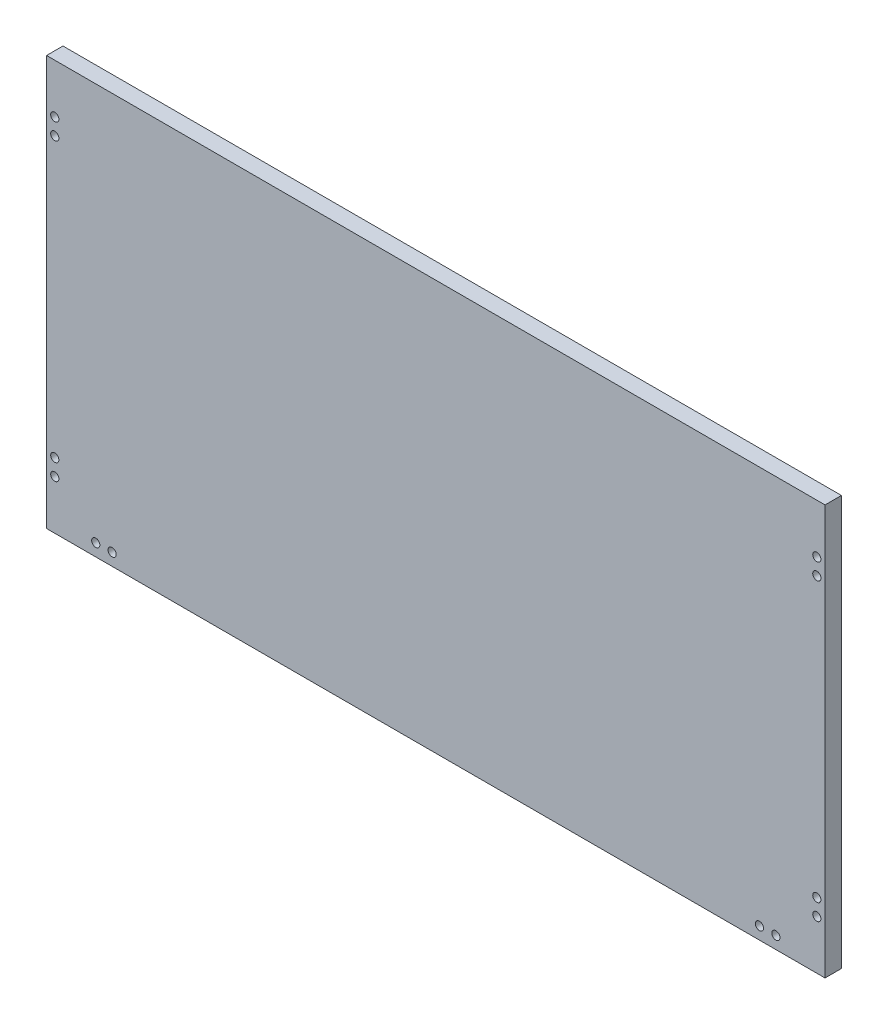
ISO-10303-21;
HEADER;
FILE_DESCRIPTION(('STEP AP214'),'2;1');
FILE_NAME('part.step','',(''),(''),'','','');
FILE_SCHEMA(('AUTOMOTIVE_DESIGN { 1 0 10303 214 1 1 1 1 }'));
ENDSEC;
DATA;
#1=APPLICATION_CONTEXT('core data for automotive mechanical design processes');
#2=APPLICATION_PROTOCOL_DEFINITION('international standard','automotive_design',2000,#1);
#3=PRODUCT_CONTEXT('',#1,'mechanical');
#4=PRODUCT('Part','Part','',(#3));
#5=PRODUCT_RELATED_PRODUCT_CATEGORY('part','',(#4));
#6=PRODUCT_DEFINITION_FORMATION('','',#4);
#7=PRODUCT_DEFINITION_CONTEXT('part definition',#1,'design');
#8=PRODUCT_DEFINITION('design','',#6,#7);
#9=PRODUCT_DEFINITION_SHAPE('','',#8);
#10=(LENGTH_UNIT() NAMED_UNIT(*) SI_UNIT(.MILLI.,.METRE.));
#11=(NAMED_UNIT(*) PLANE_ANGLE_UNIT() SI_UNIT($,.RADIAN.));
#12=(NAMED_UNIT(*) SI_UNIT($,.STERADIAN.) SOLID_ANGLE_UNIT());
#13=UNCERTAINTY_MEASURE_WITH_UNIT(LENGTH_MEASURE(1.E-05),#10,'distance_accuracy_value','');
#14=(GEOMETRIC_REPRESENTATION_CONTEXT(3) GLOBAL_UNCERTAINTY_ASSIGNED_CONTEXT((#13)) GLOBAL_UNIT_ASSIGNED_CONTEXT((#10,
#11,#12)) REPRESENTATION_CONTEXT('',''));
#15=CARTESIAN_POINT('',(0.,0.,0.));
#16=DIRECTION('',(0.,0.,1.));
#17=DIRECTION('',(1.,0.,0.));
#18=AXIS2_PLACEMENT_3D('',#15,#16,#17);
#19=CARTESIAN_POINT('',(237.5,125.,10.));
#20=DIRECTION('',(-1.,0.,0.));
#21=DIRECTION('',(0.,-1.,0.));
#22=AXIS2_PLACEMENT_3D('',#19,#20,#21);
#23=PLANE('',#22);
#24=DIRECTION('',(0.,1.,0.));
#25=VECTOR('',#24,1.);
#26=CARTESIAN_POINT('',(237.5,125.,0.));
#27=LINE('',#26,#25);
#28=CARTESIAN_POINT('',(237.5,-125.,0.));
#29=VERTEX_POINT('',#28);
#30=CARTESIAN_POINT('',(237.5,125.,0.));
#31=VERTEX_POINT('',#30);
#32=EDGE_CURVE('E99',#29,#31,#27,.T.);
#33=ORIENTED_EDGE('',*,*,#32,.T.);
#34=DIRECTION('',(0.,0.,-1.));
#35=VECTOR('',#34,1.);
#36=CARTESIAN_POINT('',(237.5,125.,10.));
#37=LINE('',#36,#35);
#38=CARTESIAN_POINT('',(237.5,125.,10.));
#39=VERTEX_POINT('',#38);
#40=EDGE_CURVE('E11',#39,#31,#37,.T.);
#41=ORIENTED_EDGE('',*,*,#40,.F.);
#42=DIRECTION('',(0.,1.,0.));
#43=VECTOR('',#42,1.);
#44=CARTESIAN_POINT('',(237.5,125.,10.));
#45=LINE('',#44,#43);
#46=CARTESIAN_POINT('',(237.5,-125.,10.));
#47=VERTEX_POINT('',#46);
#48=EDGE_CURVE('E87',#47,#39,#45,.T.);
#49=ORIENTED_EDGE('',*,*,#48,.F.);
#50=DIRECTION('',(0.,0.,-1.));
#51=VECTOR('',#50,1.);
#52=CARTESIAN_POINT('',(237.5,-125.,10.));
#53=LINE('',#52,#51);
#54=EDGE_CURVE('E95',#47,#29,#53,.T.);
#55=ORIENTED_EDGE('',*,*,#54,.T.);
#56=EDGE_LOOP('',(#33,#41,#49,#55));
#57=FACE_BOUND('',#56,.T.);
#58=ADVANCED_FACE('F36',(#57),#23,.F.);
#59=CARTESIAN_POINT('',(-237.5,125.,10.));
#60=DIRECTION('',(0.,-1.,0.));
#61=DIRECTION('',(0.,0.,-1.));
#62=AXIS2_PLACEMENT_3D('',#59,#60,#61);
#63=PLANE('',#62);
#64=DIRECTION('',(-1.,0.,0.));
#65=VECTOR('',#64,1.);
#66=CARTESIAN_POINT('',(-237.5,125.,0.));
#67=LINE('',#66,#65);
#68=CARTESIAN_POINT('',(-237.5,125.,0.));
#69=VERTEX_POINT('',#68);
#70=EDGE_CURVE('E91',#31,#69,#67,.T.);
#71=ORIENTED_EDGE('',*,*,#70,.T.);
#72=DIRECTION('',(0.,0.,-1.));
#73=VECTOR('',#72,1.);
#74=CARTESIAN_POINT('',(-237.5,125.,10.));
#75=LINE('',#74,#73);
#76=CARTESIAN_POINT('',(-237.5,125.,10.));
#77=VERTEX_POINT('',#76);
#78=EDGE_CURVE('E44',#77,#69,#75,.T.);
#79=ORIENTED_EDGE('',*,*,#78,.F.);
#80=DIRECTION('',(-1.,0.,0.));
#81=VECTOR('',#80,1.);
#82=CARTESIAN_POINT('',(-237.5,125.,10.));
#83=LINE('',#82,#81);
#84=EDGE_CURVE('E82',#39,#77,#83,.T.);
#85=ORIENTED_EDGE('',*,*,#84,.F.);
#86=ORIENTED_EDGE('',*,*,#40,.T.);
#87=EDGE_LOOP('',(#71,#79,#85,#86));
#88=FACE_BOUND('',#87,.T.);
#89=ADVANCED_FACE('F90',(#88),#63,.F.);
#90=CARTESIAN_POINT('',(-237.5,125.,10.));
#91=DIRECTION('',(1.,0.,0.));
#92=DIRECTION('',(0.,1.,0.));
#93=AXIS2_PLACEMENT_3D('',#90,#91,#92);
#94=PLANE('',#93);
#95=DIRECTION('',(0.,-1.,0.));
#96=VECTOR('',#95,1.);
#97=CARTESIAN_POINT('',(-237.5,125.,0.));
#98=LINE('',#97,#96);
#99=CARTESIAN_POINT('',(-237.5,-125.,0.));
#100=VERTEX_POINT('',#99);
#101=EDGE_CURVE('E69',#69,#100,#98,.T.);
#102=ORIENTED_EDGE('',*,*,#101,.T.);
#103=DIRECTION('',(0.,0.,-1.));
#104=VECTOR('',#103,1.);
#105=CARTESIAN_POINT('',(-237.5,-125.,10.));
#106=LINE('',#105,#104);
#107=CARTESIAN_POINT('',(-237.5,-125.,10.));
#108=VERTEX_POINT('',#107);
#109=EDGE_CURVE('E92',#108,#100,#106,.T.);
#110=ORIENTED_EDGE('',*,*,#109,.F.);
#111=DIRECTION('',(0.,-1.,0.));
#112=VECTOR('',#111,1.);
#113=CARTESIAN_POINT('',(-237.5,125.,10.));
#114=LINE('',#113,#112);
#115=EDGE_CURVE('E85',#77,#108,#114,.T.);
#116=ORIENTED_EDGE('',*,*,#115,.F.);
#117=ORIENTED_EDGE('',*,*,#78,.T.);
#118=EDGE_LOOP('',(#102,#110,#116,#117));
#119=FACE_BOUND('',#118,.T.);
#120=ADVANCED_FACE('F93',(#119),#94,.F.);
#121=CARTESIAN_POINT('',(-237.5,-125.,10.));
#122=DIRECTION('',(0.,1.,0.));
#123=DIRECTION('',(0.,0.,1.));
#124=AXIS2_PLACEMENT_3D('',#121,#122,#123);
#125=PLANE('',#124);
#126=DIRECTION('',(1.,0.,0.));
#127=VECTOR('',#126,1.);
#128=CARTESIAN_POINT('',(-237.5,-125.,0.));
#129=LINE('',#128,#127);
#130=EDGE_CURVE('E75',#100,#29,#129,.T.);
#131=ORIENTED_EDGE('',*,*,#130,.T.);
#132=ORIENTED_EDGE('',*,*,#54,.F.);
#133=DIRECTION('',(1.,0.,0.));
#134=VECTOR('',#133,1.);
#135=CARTESIAN_POINT('',(-237.5,-125.,10.));
#136=LINE('',#135,#134);
#137=EDGE_CURVE('E52',#108,#47,#136,.T.);
#138=ORIENTED_EDGE('',*,*,#137,.F.);
#139=ORIENTED_EDGE('',*,*,#109,.T.);
#140=EDGE_LOOP('',(#131,#132,#138,#139));
#141=FACE_BOUND('',#140,.T.);
#142=ADVANCED_FACE('F107',(#141),#125,.F.);
#143=CARTESIAN_POINT('',(0.,0.,10.));
#144=DIRECTION('',(0.,0.,1.));
#145=DIRECTION('',(1.,0.,0.));
#146=AXIS2_PLACEMENT_3D('',#143,#144,#145);
#147=PLANE('',#146);
#148=CARTESIAN_POINT('',(-232.5,85.,10.));
#149=DIRECTION('',(0.,0.,1.));
#150=DIRECTION('',(1.,0.,0.));
#151=AXIS2_PLACEMENT_3D('',#148,#149,#150);
#152=CIRCLE('',#151,2.5);
#153=CARTESIAN_POINT('',(-230.,85.,10.));
#154=VERTEX_POINT('',#153);
#155=EDGE_CURVE('E162',#154,#154,#152,.T.);
#156=ORIENTED_EDGE('',*,*,#155,.F.);
#157=EDGE_LOOP('',(#156));
#158=FACE_BOUND('',#157,.T.);
#159=CARTESIAN_POINT('',(-207.5,-117.5,10.));
#160=DIRECTION('',(0.,0.,1.));
#161=DIRECTION('',(1.,0.,0.));
#162=AXIS2_PLACEMENT_3D('',#159,#160,#161);
#163=CIRCLE('',#162,2.5);
#164=CARTESIAN_POINT('',(-205.,-117.5,10.));
#165=VERTEX_POINT('',#164);
#166=EDGE_CURVE('E156',#165,#165,#163,.T.);
#167=ORIENTED_EDGE('',*,*,#166,.F.);
#168=EDGE_LOOP('',(#167));
#169=FACE_BOUND('',#168,.T.);
#170=CARTESIAN_POINT('',(-197.5,-117.5,10.));
#171=DIRECTION('',(0.,0.,1.));
#172=DIRECTION('',(1.,0.,0.));
#173=AXIS2_PLACEMENT_3D('',#170,#171,#172);
#174=CIRCLE('',#173,2.5);
#175=CARTESIAN_POINT('',(-195.,-117.5,10.));
#176=VERTEX_POINT('',#175);
#177=EDGE_CURVE('E150',#176,#176,#174,.T.);
#178=ORIENTED_EDGE('',*,*,#177,.F.);
#179=EDGE_LOOP('',(#178));
#180=FACE_BOUND('',#179,.T.);
#181=CARTESIAN_POINT('',(197.5,-117.5,10.));
#182=DIRECTION('',(0.,0.,1.));
#183=DIRECTION('',(1.,0.,0.));
#184=AXIS2_PLACEMENT_3D('',#181,#182,#183);
#185=CIRCLE('',#184,2.5);
#186=CARTESIAN_POINT('',(200.,-117.5,10.));
#187=VERTEX_POINT('',#186);
#188=EDGE_CURVE('E132',#187,#187,#185,.T.);
#189=ORIENTED_EDGE('',*,*,#188,.F.);
#190=EDGE_LOOP('',(#189));
#191=FACE_BOUND('',#190,.T.);
#192=CARTESIAN_POINT('',(232.5,-85.,10.));
#193=DIRECTION('',(0.,0.,1.));
#194=DIRECTION('',(1.,0.,0.));
#195=AXIS2_PLACEMENT_3D('',#192,#193,#194);
#196=CIRCLE('',#195,2.5);
#197=CARTESIAN_POINT('',(235.,-85.,10.));
#198=VERTEX_POINT('',#197);
#199=EDGE_CURVE('E133',#198,#198,#196,.T.);
#200=ORIENTED_EDGE('',*,*,#199,.F.);
#201=EDGE_LOOP('',(#200));
#202=FACE_BOUND('',#201,.T.);
#203=CARTESIAN_POINT('',(232.5,85.,10.));
#204=DIRECTION('',(0.,0.,1.));
#205=DIRECTION('',(1.,0.,0.));
#206=AXIS2_PLACEMENT_3D('',#203,#204,#205);
#207=CIRCLE('',#206,2.5);
#208=CARTESIAN_POINT('',(235.,85.,10.));
#209=VERTEX_POINT('',#208);
#210=EDGE_CURVE('E140',#209,#209,#207,.T.);
#211=ORIENTED_EDGE('',*,*,#210,.F.);
#212=EDGE_LOOP('',(#211));
#213=FACE_BOUND('',#212,.T.);
#214=CARTESIAN_POINT('',(232.5,95.,10.));
#215=DIRECTION('',(0.,0.,1.));
#216=DIRECTION('',(1.,0.,0.));
#217=AXIS2_PLACEMENT_3D('',#214,#215,#216);
#218=CIRCLE('',#217,2.5);
#219=CARTESIAN_POINT('',(235.,95.,10.));
#220=VERTEX_POINT('',#219);
#221=EDGE_CURVE('E119',#220,#220,#218,.T.);
#222=ORIENTED_EDGE('',*,*,#221,.F.);
#223=EDGE_LOOP('',(#222));
#224=FACE_BOUND('',#223,.T.);
#225=CARTESIAN_POINT('',(207.5,-117.5,10.));
#226=DIRECTION('',(0.,0.,1.));
#227=DIRECTION('',(1.,0.,0.));
#228=AXIS2_PLACEMENT_3D('',#225,#226,#227);
#229=CIRCLE('',#228,2.5);
#230=CARTESIAN_POINT('',(210.,-117.5,10.));
#231=VERTEX_POINT('',#230);
#232=EDGE_CURVE('E126',#231,#231,#229,.T.);
#233=ORIENTED_EDGE('',*,*,#232,.F.);
#234=EDGE_LOOP('',(#233));
#235=FACE_BOUND('',#234,.T.);
#236=CARTESIAN_POINT('',(-232.5,-95.,10.));
#237=DIRECTION('',(0.,0.,1.));
#238=DIRECTION('',(1.,0.,0.));
#239=AXIS2_PLACEMENT_3D('',#236,#237,#238);
#240=CIRCLE('',#239,2.5);
#241=CARTESIAN_POINT('',(-230.,-95.,10.));
#242=VERTEX_POINT('',#241);
#243=EDGE_CURVE('E179',#242,#242,#240,.T.);
#244=ORIENTED_EDGE('',*,*,#243,.F.);
#245=EDGE_LOOP('',(#244));
#246=FACE_BOUND('',#245,.T.);
#247=CARTESIAN_POINT('',(-232.5,-85.,10.));
#248=DIRECTION('',(0.,0.,1.));
#249=DIRECTION('',(1.,0.,0.));
#250=AXIS2_PLACEMENT_3D('',#247,#248,#249);
#251=CIRCLE('',#250,2.5);
#252=CARTESIAN_POINT('',(-230.,-85.,10.));
#253=VERTEX_POINT('',#252);
#254=EDGE_CURVE('E167',#253,#253,#251,.T.);
#255=ORIENTED_EDGE('',*,*,#254,.F.);
#256=EDGE_LOOP('',(#255));
#257=FACE_BOUND('',#256,.T.);
#258=CARTESIAN_POINT('',(232.5,-95.,10.));
#259=DIRECTION('',(0.,0.,1.));
#260=DIRECTION('',(1.,0.,0.));
#261=AXIS2_PLACEMENT_3D('',#258,#259,#260);
#262=CIRCLE('',#261,2.5);
#263=CARTESIAN_POINT('',(235.,-95.,10.));
#264=VERTEX_POINT('',#263);
#265=EDGE_CURVE('E174',#264,#264,#262,.T.);
#266=ORIENTED_EDGE('',*,*,#265,.F.);
#267=EDGE_LOOP('',(#266));
#268=FACE_BOUND('',#267,.T.);
#269=CARTESIAN_POINT('',(-232.5,95.,10.));
#270=DIRECTION('',(0.,0.,1.));
#271=DIRECTION('',(1.,0.,0.));
#272=AXIS2_PLACEMENT_3D('',#269,#270,#271);
#273=CIRCLE('',#272,2.5);
#274=CARTESIAN_POINT('',(-230.,95.,10.));
#275=VERTEX_POINT('',#274);
#276=EDGE_CURVE('E113',#275,#275,#273,.T.);
#277=ORIENTED_EDGE('',*,*,#276,.F.);
#278=EDGE_LOOP('',(#277));
#279=FACE_BOUND('',#278,.T.);
#280=ORIENTED_EDGE('',*,*,#48,.T.);
#281=ORIENTED_EDGE('',*,*,#84,.T.);
#282=ORIENTED_EDGE('',*,*,#115,.T.);
#283=ORIENTED_EDGE('',*,*,#137,.T.);
#284=EDGE_LOOP('',(#280,#281,#282,#283));
#285=FACE_BOUND('',#284,.T.);
#286=ADVANCED_FACE('F83',(#158,#169,#180,#191,#202,#213,#224,#235,#246,#257,#268,#279,#285),
#147,.T.);
#287=CARTESIAN_POINT('',(0.,0.,0.));
#288=DIRECTION('',(0.,0.,1.));
#289=DIRECTION('',(1.,0.,0.));
#290=AXIS2_PLACEMENT_3D('',#287,#288,#289);
#291=PLANE('',#290);
#292=CARTESIAN_POINT('',(-232.5,85.,0.));
#293=DIRECTION('',(0.,0.,1.));
#294=DIRECTION('',(1.,0.,0.));
#295=AXIS2_PLACEMENT_3D('',#292,#293,#294);
#296=CIRCLE('',#295,2.5);
#297=CARTESIAN_POINT('',(-230.,85.,0.));
#298=VERTEX_POINT('',#297);
#299=EDGE_CURVE('E116',#298,#298,#296,.T.);
#300=ORIENTED_EDGE('',*,*,#299,.T.);
#301=EDGE_LOOP('',(#300));
#302=FACE_BOUND('',#301,.T.);
#303=CARTESIAN_POINT('',(-207.5,-117.5,0.));
#304=DIRECTION('',(0.,0.,1.));
#305=DIRECTION('',(1.,0.,0.));
#306=AXIS2_PLACEMENT_3D('',#303,#304,#305);
#307=CIRCLE('',#306,2.5);
#308=CARTESIAN_POINT('',(-205.,-117.5,0.));
#309=VERTEX_POINT('',#308);
#310=EDGE_CURVE('E159',#309,#309,#307,.T.);
#311=ORIENTED_EDGE('',*,*,#310,.T.);
#312=EDGE_LOOP('',(#311));
#313=FACE_BOUND('',#312,.T.);
#314=CARTESIAN_POINT('',(-197.5,-117.5,0.));
#315=DIRECTION('',(0.,0.,1.));
#316=DIRECTION('',(1.,0.,0.));
#317=AXIS2_PLACEMENT_3D('',#314,#315,#316);
#318=CIRCLE('',#317,2.5);
#319=CARTESIAN_POINT('',(-195.,-117.5,0.));
#320=VERTEX_POINT('',#319);
#321=EDGE_CURVE('E153',#320,#320,#318,.T.);
#322=ORIENTED_EDGE('',*,*,#321,.T.);
#323=EDGE_LOOP('',(#322));
#324=FACE_BOUND('',#323,.T.);
#325=CARTESIAN_POINT('',(197.5,-117.5,0.));
#326=DIRECTION('',(0.,0.,1.));
#327=DIRECTION('',(1.,0.,0.));
#328=AXIS2_PLACEMENT_3D('',#325,#326,#327);
#329=CIRCLE('',#328,2.5);
#330=CARTESIAN_POINT('',(200.,-117.5,0.));
#331=VERTEX_POINT('',#330);
#332=EDGE_CURVE('E147',#331,#331,#329,.T.);
#333=ORIENTED_EDGE('',*,*,#332,.T.);
#334=EDGE_LOOP('',(#333));
#335=FACE_BOUND('',#334,.T.);
#336=CARTESIAN_POINT('',(232.5,-85.,0.));
#337=DIRECTION('',(0.,0.,1.));
#338=DIRECTION('',(1.,0.,0.));
#339=AXIS2_PLACEMENT_3D('',#336,#337,#338);
#340=CIRCLE('',#339,2.5);
#341=CARTESIAN_POINT('',(235.,-85.,0.));
#342=VERTEX_POINT('',#341);
#343=EDGE_CURVE('E136',#342,#342,#340,.T.);
#344=ORIENTED_EDGE('',*,*,#343,.T.);
#345=EDGE_LOOP('',(#344));
#346=FACE_BOUND('',#345,.T.);
#347=CARTESIAN_POINT('',(232.5,85.,0.));
#348=DIRECTION('',(0.,0.,1.));
#349=DIRECTION('',(1.,0.,0.));
#350=AXIS2_PLACEMENT_3D('',#347,#348,#349);
#351=CIRCLE('',#350,2.5);
#352=CARTESIAN_POINT('',(235.,85.,0.));
#353=VERTEX_POINT('',#352);
#354=EDGE_CURVE('E123',#353,#353,#351,.T.);
#355=ORIENTED_EDGE('',*,*,#354,.T.);
#356=EDGE_LOOP('',(#355));
#357=FACE_BOUND('',#356,.T.);
#358=CARTESIAN_POINT('',(232.5,95.,0.));
#359=DIRECTION('',(0.,0.,1.));
#360=DIRECTION('',(1.,0.,0.));
#361=AXIS2_PLACEMENT_3D('',#358,#359,#360);
#362=CIRCLE('',#361,2.5);
#363=CARTESIAN_POINT('',(235.,95.,0.));
#364=VERTEX_POINT('',#363);
#365=EDGE_CURVE('E122',#364,#364,#362,.T.);
#366=ORIENTED_EDGE('',*,*,#365,.T.);
#367=EDGE_LOOP('',(#366));
#368=FACE_BOUND('',#367,.T.);
#369=CARTESIAN_POINT('',(207.5,-117.5,0.));
#370=DIRECTION('',(0.,0.,1.));
#371=DIRECTION('',(1.,0.,0.));
#372=AXIS2_PLACEMENT_3D('',#369,#370,#371);
#373=CIRCLE('',#372,2.5);
#374=CARTESIAN_POINT('',(210.,-117.5,0.));
#375=VERTEX_POINT('',#374);
#376=EDGE_CURVE('E129',#375,#375,#373,.T.);
#377=ORIENTED_EDGE('',*,*,#376,.T.);
#378=EDGE_LOOP('',(#377));
#379=FACE_BOUND('',#378,.T.);
#380=CARTESIAN_POINT('',(-232.5,-95.,0.));
#381=DIRECTION('',(0.,0.,1.));
#382=DIRECTION('',(1.,0.,0.));
#383=AXIS2_PLACEMENT_3D('',#380,#381,#382);
#384=CIRCLE('',#383,2.5);
#385=CARTESIAN_POINT('',(-230.,-95.,0.));
#386=VERTEX_POINT('',#385);
#387=EDGE_CURVE('E171',#386,#386,#384,.T.);
#388=ORIENTED_EDGE('',*,*,#387,.T.);
#389=EDGE_LOOP('',(#388));
#390=FACE_BOUND('',#389,.T.);
#391=CARTESIAN_POINT('',(-232.5,-85.,0.));
#392=DIRECTION('',(0.,0.,1.));
#393=DIRECTION('',(1.,0.,0.));
#394=AXIS2_PLACEMENT_3D('',#391,#392,#393);
#395=CIRCLE('',#394,2.5);
#396=CARTESIAN_POINT('',(-230.,-85.,0.));
#397=VERTEX_POINT('',#396);
#398=EDGE_CURVE('E170',#397,#397,#395,.T.);
#399=ORIENTED_EDGE('',*,*,#398,.T.);
#400=EDGE_LOOP('',(#399));
#401=FACE_BOUND('',#400,.T.);
#402=CARTESIAN_POINT('',(232.5,-95.,0.));
#403=DIRECTION('',(0.,0.,1.));
#404=DIRECTION('',(1.,0.,0.));
#405=AXIS2_PLACEMENT_3D('',#402,#403,#404);
#406=CIRCLE('',#405,2.5);
#407=CARTESIAN_POINT('',(235.,-95.,0.));
#408=VERTEX_POINT('',#407);
#409=EDGE_CURVE('E137',#408,#408,#406,.T.);
#410=ORIENTED_EDGE('',*,*,#409,.T.);
#411=EDGE_LOOP('',(#410));
#412=FACE_BOUND('',#411,.T.);
#413=CARTESIAN_POINT('',(-232.5,95.,0.));
#414=DIRECTION('',(0.,0.,1.));
#415=DIRECTION('',(1.,0.,0.));
#416=AXIS2_PLACEMENT_3D('',#413,#414,#415);
#417=CIRCLE('',#416,2.5);
#418=CARTESIAN_POINT('',(-230.,95.,0.));
#419=VERTEX_POINT('',#418);
#420=EDGE_CURVE('E102',#419,#419,#417,.T.);
#421=ORIENTED_EDGE('',*,*,#420,.T.);
#422=EDGE_LOOP('',(#421));
#423=FACE_BOUND('',#422,.T.);
#424=ORIENTED_EDGE('',*,*,#32,.F.);
#425=ORIENTED_EDGE('',*,*,#130,.F.);
#426=ORIENTED_EDGE('',*,*,#101,.F.);
#427=ORIENTED_EDGE('',*,*,#70,.F.);
#428=EDGE_LOOP('',(#424,#425,#426,#427));
#429=FACE_BOUND('',#428,.T.);
#430=ADVANCED_FACE('F110',(#302,#313,#324,#335,#346,#357,#368,#379,#390,#401,#412,#423,#429),
#291,.F.);
#431=CARTESIAN_POINT('',(-232.5,95.,0.));
#432=DIRECTION('',(0.,0.,1.));
#433=DIRECTION('',(1.,0.,0.));
#434=AXIS2_PLACEMENT_3D('',#431,#432,#433);
#435=CYLINDRICAL_SURFACE('',#434,2.5);
#436=ORIENTED_EDGE('',*,*,#420,.F.);
#437=EDGE_LOOP('',(#436));
#438=FACE_BOUND('',#437,.T.);
#439=ORIENTED_EDGE('',*,*,#276,.T.);
#440=EDGE_LOOP('',(#439));
#441=FACE_BOUND('',#440,.T.);
#442=ADVANCED_FACE('F205',(#438,#441),#435,.F.);
#443=CARTESIAN_POINT('',(232.5,-95.,0.));
#444=DIRECTION('',(0.,0.,1.));
#445=DIRECTION('',(1.,0.,0.));
#446=AXIS2_PLACEMENT_3D('',#443,#444,#445);
#447=CYLINDRICAL_SURFACE('',#446,2.5);
#448=ORIENTED_EDGE('',*,*,#409,.F.);
#449=EDGE_LOOP('',(#448));
#450=FACE_BOUND('',#449,.T.);
#451=ORIENTED_EDGE('',*,*,#265,.T.);
#452=EDGE_LOOP('',(#451));
#453=FACE_BOUND('',#452,.T.);
#454=ADVANCED_FACE('F207',(#450,#453),#447,.F.);
#455=CARTESIAN_POINT('',(-232.5,-85.,0.));
#456=DIRECTION('',(0.,0.,1.));
#457=DIRECTION('',(1.,0.,0.));
#458=AXIS2_PLACEMENT_3D('',#455,#456,#457);
#459=CYLINDRICAL_SURFACE('',#458,2.5);
#460=ORIENTED_EDGE('',*,*,#398,.F.);
#461=EDGE_LOOP('',(#460));
#462=FACE_BOUND('',#461,.T.);
#463=ORIENTED_EDGE('',*,*,#254,.T.);
#464=EDGE_LOOP('',(#463));
#465=FACE_BOUND('',#464,.T.);
#466=ADVANCED_FACE('F191',(#462,#465),#459,.F.);
#467=CARTESIAN_POINT('',(-232.5,-95.,0.));
#468=DIRECTION('',(0.,0.,1.));
#469=DIRECTION('',(1.,0.,0.));
#470=AXIS2_PLACEMENT_3D('',#467,#468,#469);
#471=CYLINDRICAL_SURFACE('',#470,2.5);
#472=ORIENTED_EDGE('',*,*,#387,.F.);
#473=EDGE_LOOP('',(#472));
#474=FACE_BOUND('',#473,.T.);
#475=ORIENTED_EDGE('',*,*,#243,.T.);
#476=EDGE_LOOP('',(#475));
#477=FACE_BOUND('',#476,.T.);
#478=ADVANCED_FACE('F187',(#474,#477),#471,.F.);
#479=CARTESIAN_POINT('',(207.5,-117.5,0.));
#480=DIRECTION('',(0.,0.,1.));
#481=DIRECTION('',(1.,0.,0.));
#482=AXIS2_PLACEMENT_3D('',#479,#480,#481);
#483=CYLINDRICAL_SURFACE('',#482,2.5);
#484=ORIENTED_EDGE('',*,*,#376,.F.);
#485=EDGE_LOOP('',(#484));
#486=FACE_BOUND('',#485,.T.);
#487=ORIENTED_EDGE('',*,*,#232,.T.);
#488=EDGE_LOOP('',(#487));
#489=FACE_BOUND('',#488,.T.);
#490=ADVANCED_FACE('F190',(#486,#489),#483,.F.);
#491=CARTESIAN_POINT('',(232.5,95.,0.));
#492=DIRECTION('',(0.,0.,1.));
#493=DIRECTION('',(1.,0.,0.));
#494=AXIS2_PLACEMENT_3D('',#491,#492,#493);
#495=CYLINDRICAL_SURFACE('',#494,2.5);
#496=ORIENTED_EDGE('',*,*,#365,.F.);
#497=EDGE_LOOP('',(#496));
#498=FACE_BOUND('',#497,.T.);
#499=ORIENTED_EDGE('',*,*,#221,.T.);
#500=EDGE_LOOP('',(#499));
#501=FACE_BOUND('',#500,.T.);
#502=ADVANCED_FACE('F276',(#498,#501),#495,.F.);
#503=CARTESIAN_POINT('',(232.5,85.,0.));
#504=DIRECTION('',(0.,0.,1.));
#505=DIRECTION('',(1.,0.,0.));
#506=AXIS2_PLACEMENT_3D('',#503,#504,#505);
#507=CYLINDRICAL_SURFACE('',#506,2.5);
#508=ORIENTED_EDGE('',*,*,#354,.F.);
#509=EDGE_LOOP('',(#508));
#510=FACE_BOUND('',#509,.T.);
#511=ORIENTED_EDGE('',*,*,#210,.T.);
#512=EDGE_LOOP('',(#511));
#513=FACE_BOUND('',#512,.T.);
#514=ADVANCED_FACE('F286',(#510,#513),#507,.F.);
#515=CARTESIAN_POINT('',(232.5,-85.,0.));
#516=DIRECTION('',(0.,0.,1.));
#517=DIRECTION('',(1.,0.,0.));
#518=AXIS2_PLACEMENT_3D('',#515,#516,#517);
#519=CYLINDRICAL_SURFACE('',#518,2.5);
#520=ORIENTED_EDGE('',*,*,#343,.F.);
#521=EDGE_LOOP('',(#520));
#522=FACE_BOUND('',#521,.T.);
#523=ORIENTED_EDGE('',*,*,#199,.T.);
#524=EDGE_LOOP('',(#523));
#525=FACE_BOUND('',#524,.T.);
#526=ADVANCED_FACE('F295',(#522,#525),#519,.F.);
#527=CARTESIAN_POINT('',(197.5,-117.5,0.));
#528=DIRECTION('',(0.,0.,1.));
#529=DIRECTION('',(1.,0.,0.));
#530=AXIS2_PLACEMENT_3D('',#527,#528,#529);
#531=CYLINDRICAL_SURFACE('',#530,2.5);
#532=ORIENTED_EDGE('',*,*,#332,.F.);
#533=EDGE_LOOP('',(#532));
#534=FACE_BOUND('',#533,.T.);
#535=ORIENTED_EDGE('',*,*,#188,.T.);
#536=EDGE_LOOP('',(#535));
#537=FACE_BOUND('',#536,.T.);
#538=ADVANCED_FACE('F305',(#534,#537),#531,.F.);
#539=CARTESIAN_POINT('',(-197.5,-117.5,0.));
#540=DIRECTION('',(0.,0.,1.));
#541=DIRECTION('',(1.,0.,0.));
#542=AXIS2_PLACEMENT_3D('',#539,#540,#541);
#543=CYLINDRICAL_SURFACE('',#542,2.5);
#544=ORIENTED_EDGE('',*,*,#321,.F.);
#545=EDGE_LOOP('',(#544));
#546=FACE_BOUND('',#545,.T.);
#547=ORIENTED_EDGE('',*,*,#177,.T.);
#548=EDGE_LOOP('',(#547));
#549=FACE_BOUND('',#548,.T.);
#550=ADVANCED_FACE('F315',(#546,#549),#543,.F.);
#551=CARTESIAN_POINT('',(-207.5,-117.5,0.));
#552=DIRECTION('',(0.,0.,1.));
#553=DIRECTION('',(1.,0.,0.));
#554=AXIS2_PLACEMENT_3D('',#551,#552,#553);
#555=CYLINDRICAL_SURFACE('',#554,2.5);
#556=ORIENTED_EDGE('',*,*,#310,.F.);
#557=EDGE_LOOP('',(#556));
#558=FACE_BOUND('',#557,.T.);
#559=ORIENTED_EDGE('',*,*,#166,.T.);
#560=EDGE_LOOP('',(#559));
#561=FACE_BOUND('',#560,.T.);
#562=ADVANCED_FACE('F325',(#558,#561),#555,.F.);
#563=CARTESIAN_POINT('',(-232.5,85.,0.));
#564=DIRECTION('',(0.,0.,1.));
#565=DIRECTION('',(1.,0.,0.));
#566=AXIS2_PLACEMENT_3D('',#563,#564,#565);
#567=CYLINDRICAL_SURFACE('',#566,2.5);
#568=ORIENTED_EDGE('',*,*,#299,.F.);
#569=EDGE_LOOP('',(#568));
#570=FACE_BOUND('',#569,.T.);
#571=ORIENTED_EDGE('',*,*,#155,.T.);
#572=EDGE_LOOP('',(#571));
#573=FACE_BOUND('',#572,.T.);
#574=ADVANCED_FACE('F335',(#570,#573),#567,.F.);
#575=CLOSED_SHELL('',(#58,#89,#120,#142,#286,#430,#442,#454,#466,#478,#490,#502,#514,#526,#538,
#550,#562,#574));
#576=MANIFOLD_SOLID_BREP('B2',#575);
#577=ADVANCED_BREP_SHAPE_REPRESENTATION('',(#18,#576),#14);
#578=SHAPE_DEFINITION_REPRESENTATION(#9,#577);
ENDSEC;
END-ISO-10303-21;
